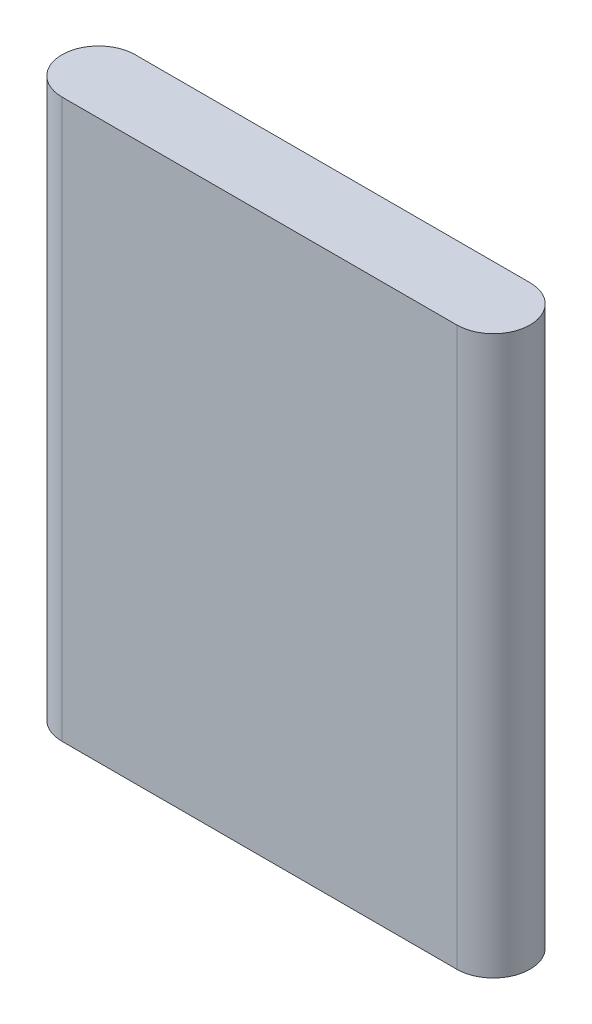
ISO-10303-21;
HEADER;
FILE_DESCRIPTION(('STEP AP214'),'2;1');
FILE_NAME('part.step','',(''),(''),'','','');
FILE_SCHEMA(('AUTOMOTIVE_DESIGN { 1 0 10303 214 1 1 1 1 }'));
ENDSEC;
DATA;
#1=APPLICATION_CONTEXT('core data for automotive mechanical design processes');
#2=APPLICATION_PROTOCOL_DEFINITION('international standard','automotive_design',2000,#1);
#3=PRODUCT_CONTEXT('',#1,'mechanical');
#4=PRODUCT('Part','Part','',(#3));
#5=PRODUCT_RELATED_PRODUCT_CATEGORY('part','',(#4));
#6=PRODUCT_DEFINITION_FORMATION('','',#4);
#7=PRODUCT_DEFINITION_CONTEXT('part definition',#1,'design');
#8=PRODUCT_DEFINITION('design','',#6,#7);
#9=PRODUCT_DEFINITION_SHAPE('','',#8);
#10=(LENGTH_UNIT() NAMED_UNIT(*) SI_UNIT(.MILLI.,.METRE.));
#11=(NAMED_UNIT(*) PLANE_ANGLE_UNIT() SI_UNIT($,.RADIAN.));
#12=(NAMED_UNIT(*) SI_UNIT($,.STERADIAN.) SOLID_ANGLE_UNIT());
#13=UNCERTAINTY_MEASURE_WITH_UNIT(LENGTH_MEASURE(1.E-05),#10,'distance_accuracy_value','');
#14=(GEOMETRIC_REPRESENTATION_CONTEXT(3) GLOBAL_UNCERTAINTY_ASSIGNED_CONTEXT((#13)) GLOBAL_UNIT_ASSIGNED_CONTEXT((#10,
#11,#12)) REPRESENTATION_CONTEXT('',''));
#15=CARTESIAN_POINT('',(0.,0.,0.));
#16=DIRECTION('',(0.,0.,1.));
#17=DIRECTION('',(1.,0.,0.));
#18=AXIS2_PLACEMENT_3D('',#15,#16,#17);
#19=CARTESIAN_POINT('',(21.3,-30.1,0.));
#20=DIRECTION('',(0.,1.,0.));
#21=DIRECTION('',(-1.,0.,0.));
#22=AXIS2_PLACEMENT_3D('',#19,#20,#21);
#23=CYLINDRICAL_SURFACE('',#22,3.95);
#24=DIRECTION('',(0.,-1.,0.));
#25=VECTOR('',#24,1.);
#26=CARTESIAN_POINT('',(21.3,-30.1,3.95));
#27=LINE('',#26,#25);
#28=CARTESIAN_POINT('',(21.3,-30.1,3.95));
#29=VERTEX_POINT('',#28);
#30=CARTESIAN_POINT('',(21.3,30.1,3.95));
#31=VERTEX_POINT('',#30);
#32=EDGE_CURVE('E105',#29,#31,#27,.F.);
#33=ORIENTED_EDGE('',*,*,#32,.F.);
#34=CARTESIAN_POINT('',(21.3,-30.1,0.));
#35=DIRECTION('',(0.,1.,0.));
#36=DIRECTION('',(0.,0.,1.));
#37=AXIS2_PLACEMENT_3D('',#34,#35,#36);
#38=CIRCLE('',#37,3.95);
#39=CARTESIAN_POINT('',(21.3,-30.1,-3.95));
#40=VERTEX_POINT('',#39);
#41=EDGE_CURVE('E43',#40,#29,#38,.F.);
#42=ORIENTED_EDGE('',*,*,#41,.F.);
#43=DIRECTION('',(0.,1.,0.));
#44=VECTOR('',#43,1.);
#45=CARTESIAN_POINT('',(21.3,0.,-3.95));
#46=LINE('',#45,#44);
#47=CARTESIAN_POINT('',(21.3,30.1,-3.95));
#48=VERTEX_POINT('',#47);
#49=EDGE_CURVE('E95',#48,#40,#46,.F.);
#50=ORIENTED_EDGE('',*,*,#49,.F.);
#51=CARTESIAN_POINT('',(21.3,30.1,0.));
#52=DIRECTION('',(0.,-1.,0.));
#53=DIRECTION('',(0.,0.,-1.));
#54=AXIS2_PLACEMENT_3D('',#51,#52,#53);
#55=CIRCLE('',#54,3.95);
#56=EDGE_CURVE('E11',#31,#48,#55,.F.);
#57=ORIENTED_EDGE('',*,*,#56,.F.);
#58=EDGE_LOOP('',(#33,#42,#50,#57));
#59=FACE_BOUND('',#58,.T.);
#60=ADVANCED_FACE('F35',(#59),#23,.T.);
#61=CARTESIAN_POINT('',(-21.3,-30.1,0.));
#62=DIRECTION('',(0.,-1.,0.));
#63=DIRECTION('',(1.,0.,0.));
#64=AXIS2_PLACEMENT_3D('',#61,#62,#63);
#65=CYLINDRICAL_SURFACE('',#64,3.95);
#66=DIRECTION('',(0.,-1.,0.));
#67=VECTOR('',#66,1.);
#68=CARTESIAN_POINT('',(-21.3,0.,-3.95));
#69=LINE('',#68,#67);
#70=CARTESIAN_POINT('',(-21.3,-30.1,-3.95));
#71=VERTEX_POINT('',#70);
#72=CARTESIAN_POINT('',(-21.3,30.1,-3.95));
#73=VERTEX_POINT('',#72);
#74=EDGE_CURVE('E88',#71,#73,#69,.F.);
#75=ORIENTED_EDGE('',*,*,#74,.F.);
#76=CARTESIAN_POINT('',(-21.3,-30.1,0.));
#77=DIRECTION('',(0.,1.,0.));
#78=DIRECTION('',(0.,0.,1.));
#79=AXIS2_PLACEMENT_3D('',#76,#77,#78);
#80=CIRCLE('',#79,3.95);
#81=CARTESIAN_POINT('',(-21.3,-30.1,3.95));
#82=VERTEX_POINT('',#81);
#83=EDGE_CURVE('E73',#82,#71,#80,.F.);
#84=ORIENTED_EDGE('',*,*,#83,.F.);
#85=DIRECTION('',(0.,1.,0.));
#86=VECTOR('',#85,1.);
#87=CARTESIAN_POINT('',(-21.3,-30.1,3.95));
#88=LINE('',#87,#86);
#89=CARTESIAN_POINT('',(-21.3,30.1,3.95));
#90=VERTEX_POINT('',#89);
#91=EDGE_CURVE('E84',#90,#82,#88,.F.);
#92=ORIENTED_EDGE('',*,*,#91,.F.);
#93=CARTESIAN_POINT('',(-21.3,30.1,0.));
#94=DIRECTION('',(0.,-1.,0.));
#95=DIRECTION('',(0.,0.,-1.));
#96=AXIS2_PLACEMENT_3D('',#93,#94,#95);
#97=CIRCLE('',#96,3.95);
#98=EDGE_CURVE('E83',#73,#90,#97,.F.);
#99=ORIENTED_EDGE('',*,*,#98,.F.);
#100=EDGE_LOOP('',(#75,#84,#92,#99));
#101=FACE_BOUND('',#100,.T.);
#102=ADVANCED_FACE('F89',(#101),#65,.T.);
#103=CARTESIAN_POINT('',(-25.25,30.1,3.95));
#104=DIRECTION('',(0.,-1.,0.));
#105=DIRECTION('',(0.,0.,-1.));
#106=AXIS2_PLACEMENT_3D('',#103,#104,#105);
#107=PLANE('',#106);
#108=DIRECTION('',(-1.,0.,0.));
#109=VECTOR('',#108,1.);
#110=CARTESIAN_POINT('',(-25.25,30.1,3.95));
#111=LINE('',#110,#109);
#112=EDGE_CURVE('E96',#31,#90,#111,.T.);
#113=ORIENTED_EDGE('',*,*,#112,.F.);
#114=ORIENTED_EDGE('',*,*,#56,.T.);
#115=DIRECTION('',(-1.,0.,0.));
#116=VECTOR('',#115,1.);
#117=CARTESIAN_POINT('',(-25.25,30.1,-3.95));
#118=LINE('',#117,#116);
#119=EDGE_CURVE('E97',#48,#73,#118,.T.);
#120=ORIENTED_EDGE('',*,*,#119,.T.);
#121=ORIENTED_EDGE('',*,*,#98,.T.);
#122=EDGE_LOOP('',(#113,#114,#120,#121));
#123=FACE_BOUND('',#122,.T.);
#124=ADVANCED_FACE('F110',(#123),#107,.F.);
#125=CARTESIAN_POINT('',(-25.25,-30.1,3.95));
#126=DIRECTION('',(0.,1.,0.));
#127=DIRECTION('',(0.,0.,1.));
#128=AXIS2_PLACEMENT_3D('',#125,#126,#127);
#129=PLANE('',#128);
#130=DIRECTION('',(1.,0.,0.));
#131=VECTOR('',#130,1.);
#132=CARTESIAN_POINT('',(-25.25,-30.1,-3.95));
#133=LINE('',#132,#131);
#134=EDGE_CURVE('E77',#71,#40,#133,.T.);
#135=ORIENTED_EDGE('',*,*,#134,.T.);
#136=ORIENTED_EDGE('',*,*,#41,.T.);
#137=DIRECTION('',(1.,0.,0.));
#138=VECTOR('',#137,1.);
#139=CARTESIAN_POINT('',(-25.25,-30.1,3.95));
#140=LINE('',#139,#138);
#141=EDGE_CURVE('E79',#82,#29,#140,.T.);
#142=ORIENTED_EDGE('',*,*,#141,.F.);
#143=ORIENTED_EDGE('',*,*,#83,.T.);
#144=EDGE_LOOP('',(#135,#136,#142,#143));
#145=FACE_BOUND('',#144,.T.);
#146=ADVANCED_FACE('F75',(#145),#129,.F.);
#147=CARTESIAN_POINT('',(0.,0.,3.95));
#148=DIRECTION('',(0.,0.,1.));
#149=DIRECTION('',(1.,0.,0.));
#150=AXIS2_PLACEMENT_3D('',#147,#148,#149);
#151=PLANE('',#150);
#152=ORIENTED_EDGE('',*,*,#141,.T.);
#153=ORIENTED_EDGE('',*,*,#32,.T.);
#154=ORIENTED_EDGE('',*,*,#112,.T.);
#155=ORIENTED_EDGE('',*,*,#91,.T.);
#156=EDGE_LOOP('',(#152,#153,#154,#155));
#157=FACE_BOUND('',#156,.T.);
#158=ADVANCED_FACE('F109',(#157),#151,.T.);
#159=CARTESIAN_POINT('',(0.,0.,-3.95));
#160=DIRECTION('',(0.,0.,1.));
#161=DIRECTION('',(1.,0.,0.));
#162=AXIS2_PLACEMENT_3D('',#159,#160,#161);
#163=PLANE('',#162);
#164=ORIENTED_EDGE('',*,*,#119,.F.);
#165=ORIENTED_EDGE('',*,*,#49,.T.);
#166=ORIENTED_EDGE('',*,*,#134,.F.);
#167=ORIENTED_EDGE('',*,*,#74,.T.);
#168=EDGE_LOOP('',(#164,#165,#166,#167));
#169=FACE_BOUND('',#168,.T.);
#170=ADVANCED_FACE('F94',(#169),#163,.F.);
#171=CLOSED_SHELL('',(#60,#102,#124,#146,#158,#170));
#172=MANIFOLD_SOLID_BREP('B2',#171);
#173=ADVANCED_BREP_SHAPE_REPRESENTATION('',(#18,#172),#14);
#174=SHAPE_DEFINITION_REPRESENTATION(#9,#173);
ENDSEC;
END-ISO-10303-21;
